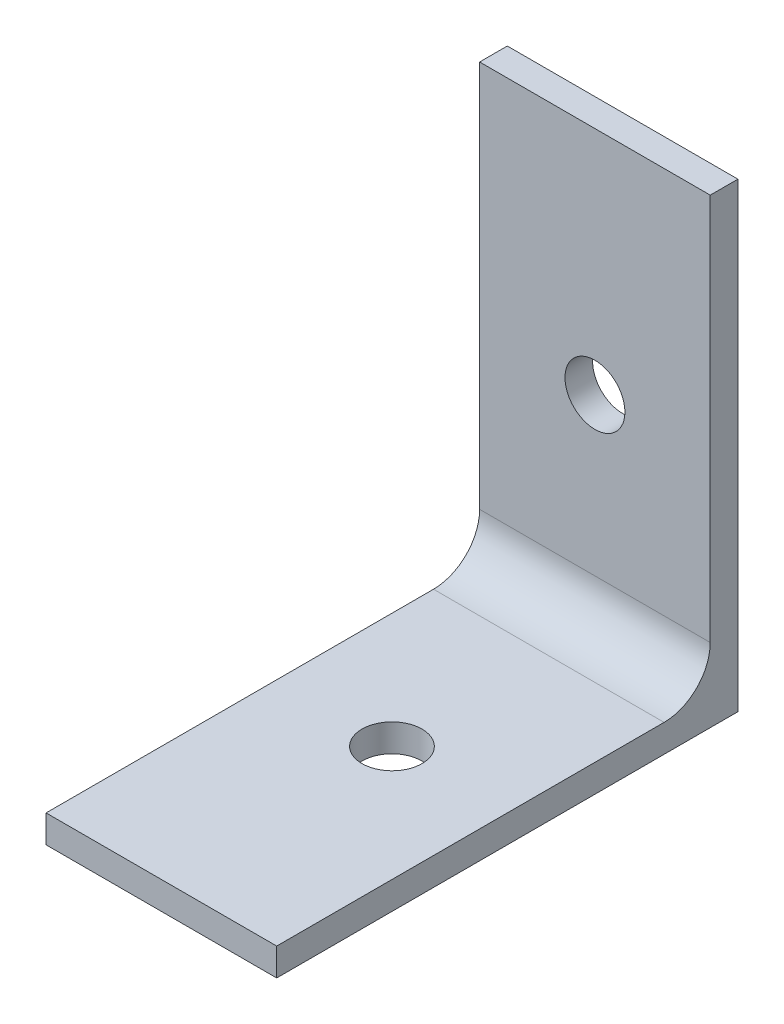
ISO-10303-21;
HEADER;
FILE_DESCRIPTION(('STEP AP214'),'2;1');
FILE_NAME('part.step','',(''),(''),'','','');
FILE_SCHEMA(('AUTOMOTIVE_DESIGN { 1 0 10303 214 1 1 1 1 }'));
ENDSEC;
DATA;
#1=APPLICATION_CONTEXT('core data for automotive mechanical design processes');
#2=APPLICATION_PROTOCOL_DEFINITION('international standard','automotive_design',2000,#1);
#3=PRODUCT_CONTEXT('',#1,'mechanical');
#4=PRODUCT('Part','Part','',(#3));
#5=PRODUCT_RELATED_PRODUCT_CATEGORY('part','',(#4));
#6=PRODUCT_DEFINITION_FORMATION('','',#4);
#7=PRODUCT_DEFINITION_CONTEXT('part definition',#1,'design');
#8=PRODUCT_DEFINITION('design','',#6,#7);
#9=PRODUCT_DEFINITION_SHAPE('','',#8);
#10=(LENGTH_UNIT() NAMED_UNIT(*) SI_UNIT(.MILLI.,.METRE.));
#11=(NAMED_UNIT(*) PLANE_ANGLE_UNIT() SI_UNIT($,.RADIAN.));
#12=(NAMED_UNIT(*) SI_UNIT($,.STERADIAN.) SOLID_ANGLE_UNIT());
#13=UNCERTAINTY_MEASURE_WITH_UNIT(LENGTH_MEASURE(1.E-05),#10,'distance_accuracy_value','');
#14=(GEOMETRIC_REPRESENTATION_CONTEXT(3) GLOBAL_UNCERTAINTY_ASSIGNED_CONTEXT((#13)) GLOBAL_UNIT_ASSIGNED_CONTEXT((#10,
#11,#12)) REPRESENTATION_CONTEXT('',''));
#15=CARTESIAN_POINT('',(0.,0.,0.));
#16=DIRECTION('',(0.,0.,1.));
#17=DIRECTION('',(1.,0.,0.));
#18=AXIS2_PLACEMENT_3D('',#15,#16,#17);
#19=CARTESIAN_POINT('',(-18.5339966832504,23.876,1.524));
#20=DIRECTION('',(1.,0.,0.));
#21=DIRECTION('',(0.,0.,-1.));
#22=AXIS2_PLACEMENT_3D('',#19,#20,#21);
#23=PLANE('',#22);
#24=DIRECTION('',(0.,-1.,0.));
#25=VECTOR('',#24,1.);
#26=CARTESIAN_POINT('',(-18.5339966832504,23.876,0.));
#27=LINE('',#26,#25);
#28=CARTESIAN_POINT('',(-18.5339966832504,23.876,0.));
#29=VERTEX_POINT('',#28);
#30=CARTESIAN_POINT('',(-18.5339966832504,-1.524,0.));
#31=VERTEX_POINT('',#30);
#32=EDGE_CURVE('E91',#29,#31,#27,.T.);
#33=ORIENTED_EDGE('',*,*,#32,.T.);
#34=DIRECTION('',(0.,0.,-1.));
#35=VECTOR('',#34,1.);
#36=CARTESIAN_POINT('',(-18.5339966832504,-1.524,0.));
#37=LINE('',#36,#35);
#38=CARTESIAN_POINT('',(-18.5339966832504,-1.524,25.4));
#39=VERTEX_POINT('',#38);
#40=EDGE_CURVE('E95',#39,#31,#37,.T.);
#41=ORIENTED_EDGE('',*,*,#40,.F.);
#42=DIRECTION('',(0.,1.,0.));
#43=VECTOR('',#42,1.);
#44=CARTESIAN_POINT('',(-18.5339966832504,-1.524,25.4));
#45=LINE('',#44,#43);
#46=CARTESIAN_POINT('',(-18.5339966832504,0.,25.4));
#47=VERTEX_POINT('',#46);
#48=EDGE_CURVE('E125',#39,#47,#45,.T.);
#49=ORIENTED_EDGE('',*,*,#48,.T.);
#50=DIRECTION('',(0.,0.,-1.));
#51=VECTOR('',#50,1.);
#52=CARTESIAN_POINT('',(-18.5339966832504,0.,0.));
#53=LINE('',#52,#51);
#54=CARTESIAN_POINT('',(-18.5339966832504,0.,4.064));
#55=VERTEX_POINT('',#54);
#56=EDGE_CURVE('E130',#47,#55,#53,.T.);
#57=ORIENTED_EDGE('',*,*,#56,.T.);
#58=CARTESIAN_POINT('',(-18.5339966832504,2.54,4.064));
#59=DIRECTION('',(1.,0.,0.));
#60=DIRECTION('',(0.,0.,-1.));
#61=AXIS2_PLACEMENT_3D('',#58,#59,#60);
#62=CIRCLE('',#61,2.54);
#63=CARTESIAN_POINT('',(-18.5339966832504,2.54,1.524));
#64=VERTEX_POINT('',#63);
#65=EDGE_CURVE('E11',#55,#64,#62,.T.);
#66=ORIENTED_EDGE('',*,*,#65,.T.);
#67=DIRECTION('',(0.,-1.,0.));
#68=VECTOR('',#67,1.);
#69=CARTESIAN_POINT('',(-18.5339966832504,23.876,1.524));
#70=LINE('',#69,#68);
#71=CARTESIAN_POINT('',(-18.5339966832504,23.876,1.524));
#72=VERTEX_POINT('',#71);
#73=EDGE_CURVE('E141',#72,#64,#70,.T.);
#74=ORIENTED_EDGE('',*,*,#73,.F.);
#75=DIRECTION('',(0.,0.,-1.));
#76=VECTOR('',#75,1.);
#77=CARTESIAN_POINT('',(-18.5339966832504,23.876,1.524));
#78=LINE('',#77,#76);
#79=EDGE_CURVE('E98',#72,#29,#78,.T.);
#80=ORIENTED_EDGE('',*,*,#79,.T.);
#81=EDGE_LOOP('',(#33,#41,#49,#57,#66,#74,#80));
#82=FACE_BOUND('',#81,.T.);
#83=ADVANCED_FACE('F32',(#82),#23,.F.);
#84=CARTESIAN_POINT('',(-5.83399668325041,23.876,1.524));
#85=DIRECTION('',(-1.,0.,0.));
#86=DIRECTION('',(0.,-1.,0.));
#87=AXIS2_PLACEMENT_3D('',#84,#85,#86);
#88=PLANE('',#87);
#89=DIRECTION('',(0.,1.,0.));
#90=VECTOR('',#89,1.);
#91=CARTESIAN_POINT('',(-5.83399668325041,23.876,0.));
#92=LINE('',#91,#90);
#93=CARTESIAN_POINT('',(-5.83399668325041,-1.524,0.));
#94=VERTEX_POINT('',#93);
#95=CARTESIAN_POINT('',(-5.83399668325041,23.876,0.));
#96=VERTEX_POINT('',#95);
#97=EDGE_CURVE('E101',#94,#96,#92,.T.);
#98=ORIENTED_EDGE('',*,*,#97,.T.);
#99=DIRECTION('',(0.,0.,-1.));
#100=VECTOR('',#99,1.);
#101=CARTESIAN_POINT('',(-5.83399668325041,23.876,1.524));
#102=LINE('',#101,#100);
#103=CARTESIAN_POINT('',(-5.83399668325041,23.876,1.524));
#104=VERTEX_POINT('',#103);
#105=EDGE_CURVE('E143',#104,#96,#102,.T.);
#106=ORIENTED_EDGE('',*,*,#105,.F.);
#107=DIRECTION('',(0.,1.,0.));
#108=VECTOR('',#107,1.);
#109=CARTESIAN_POINT('',(-5.83399668325041,23.876,1.524));
#110=LINE('',#109,#108);
#111=CARTESIAN_POINT('',(-5.83399668325041,2.54,1.524));
#112=VERTEX_POINT('',#111);
#113=EDGE_CURVE('E136',#112,#104,#110,.T.);
#114=ORIENTED_EDGE('',*,*,#113,.F.);
#115=CARTESIAN_POINT('',(-5.83399668325041,2.54,4.064));
#116=DIRECTION('',(-1.,0.,0.));
#117=DIRECTION('',(0.,-1.,0.));
#118=AXIS2_PLACEMENT_3D('',#115,#116,#117);
#119=CIRCLE('',#118,2.54);
#120=CARTESIAN_POINT('',(-5.83399668325041,0.,4.064));
#121=VERTEX_POINT('',#120);
#122=EDGE_CURVE('E40',#112,#121,#119,.T.);
#123=ORIENTED_EDGE('',*,*,#122,.T.);
#124=DIRECTION('',(0.,0.,1.));
#125=VECTOR('',#124,1.);
#126=CARTESIAN_POINT('',(-5.83399668325041,0.,0.));
#127=LINE('',#126,#125);
#128=CARTESIAN_POINT('',(-5.83399668325041,0.,25.4));
#129=VERTEX_POINT('',#128);
#130=EDGE_CURVE('E117',#121,#129,#127,.T.);
#131=ORIENTED_EDGE('',*,*,#130,.T.);
#132=DIRECTION('',(0.,1.,0.));
#133=VECTOR('',#132,1.);
#134=CARTESIAN_POINT('',(-5.83399668325041,-1.524,25.4));
#135=LINE('',#134,#133);
#136=CARTESIAN_POINT('',(-5.83399668325041,-1.524,25.4));
#137=VERTEX_POINT('',#136);
#138=EDGE_CURVE('E102',#137,#129,#135,.T.);
#139=ORIENTED_EDGE('',*,*,#138,.F.);
#140=DIRECTION('',(0.,0.,1.));
#141=VECTOR('',#140,1.);
#142=CARTESIAN_POINT('',(-5.83399668325041,-1.524,0.));
#143=LINE('',#142,#141);
#144=EDGE_CURVE('E109',#94,#137,#143,.T.);
#145=ORIENTED_EDGE('',*,*,#144,.F.);
#146=EDGE_LOOP('',(#98,#106,#114,#123,#131,#139,#145));
#147=FACE_BOUND('',#146,.T.);
#148=ADVANCED_FACE('F158',(#147),#88,.F.);
#149=CARTESIAN_POINT('',(-18.5339966832504,23.876,1.524));
#150=DIRECTION('',(0.,-1.,0.));
#151=DIRECTION('',(0.,0.,-1.));
#152=AXIS2_PLACEMENT_3D('',#149,#150,#151);
#153=PLANE('',#152);
#154=DIRECTION('',(-1.,0.,0.));
#155=VECTOR('',#154,1.);
#156=CARTESIAN_POINT('',(-18.5339966832504,23.876,0.));
#157=LINE('',#156,#155);
#158=EDGE_CURVE('E139',#96,#29,#157,.T.);
#159=ORIENTED_EDGE('',*,*,#158,.T.);
#160=ORIENTED_EDGE('',*,*,#79,.F.);
#161=DIRECTION('',(-1.,0.,0.));
#162=VECTOR('',#161,1.);
#163=CARTESIAN_POINT('',(-18.5339966832504,23.876,1.524));
#164=LINE('',#163,#162);
#165=EDGE_CURVE('E135',#104,#72,#164,.T.);
#166=ORIENTED_EDGE('',*,*,#165,.F.);
#167=ORIENTED_EDGE('',*,*,#105,.T.);
#168=EDGE_LOOP('',(#159,#160,#166,#167));
#169=FACE_BOUND('',#168,.T.);
#170=ADVANCED_FACE('F172',(#169),#153,.F.);
#171=CARTESIAN_POINT('',(0.,0.,1.524));
#172=DIRECTION('',(0.,0.,1.));
#173=DIRECTION('',(1.,0.,0.));
#174=AXIS2_PLACEMENT_3D('',#171,#172,#173);
#175=PLANE('',#174);
#176=CARTESIAN_POINT('',(-12.1839966832504,11.176,1.524));
#177=DIRECTION('',(0.,0.,1.));
#178=DIRECTION('',(1.,0.,0.));
#179=AXIS2_PLACEMENT_3D('',#176,#177,#178);
#180=CIRCLE('',#179,1.651);
#181=CARTESIAN_POINT('',(-10.5329966832504,11.176,1.524));
#182=VERTEX_POINT('',#181);
#183=EDGE_CURVE('E120',#182,#182,#180,.T.);
#184=ORIENTED_EDGE('',*,*,#183,.F.);
#185=EDGE_LOOP('',(#184));
#186=FACE_BOUND('',#185,.T.);
#187=ORIENTED_EDGE('',*,*,#73,.T.);
#188=DIRECTION('',(1.,0.,0.));
#189=VECTOR('',#188,1.);
#190=CARTESIAN_POINT('',(-5.83399668325041,2.54,1.524));
#191=LINE('',#190,#189);
#192=EDGE_CURVE('E146',#64,#112,#191,.T.);
#193=ORIENTED_EDGE('',*,*,#192,.T.);
#194=ORIENTED_EDGE('',*,*,#113,.T.);
#195=ORIENTED_EDGE('',*,*,#165,.T.);
#196=EDGE_LOOP('',(#187,#193,#194,#195));
#197=FACE_BOUND('',#196,.T.);
#198=ADVANCED_FACE('F168',(#186,#197),#175,.T.);
#199=CARTESIAN_POINT('',(0.,0.,0.));
#200=DIRECTION('',(0.,0.,1.));
#201=DIRECTION('',(1.,0.,0.));
#202=AXIS2_PLACEMENT_3D('',#199,#200,#201);
#203=PLANE('',#202);
#204=CARTESIAN_POINT('',(-12.1839966832504,11.176,0.));
#205=DIRECTION('',(0.,0.,1.));
#206=DIRECTION('',(1.,0.,0.));
#207=AXIS2_PLACEMENT_3D('',#204,#205,#206);
#208=CIRCLE('',#207,1.651);
#209=CARTESIAN_POINT('',(-10.5329966832504,11.176,0.));
#210=VERTEX_POINT('',#209);
#211=EDGE_CURVE('E133',#210,#210,#208,.T.);
#212=ORIENTED_EDGE('',*,*,#211,.T.);
#213=EDGE_LOOP('',(#212));
#214=FACE_BOUND('',#213,.T.);
#215=ORIENTED_EDGE('',*,*,#32,.F.);
#216=ORIENTED_EDGE('',*,*,#158,.F.);
#217=ORIENTED_EDGE('',*,*,#97,.F.);
#218=DIRECTION('',(1.,0.,0.));
#219=VECTOR('',#218,1.);
#220=CARTESIAN_POINT('',(-18.5339966832504,-1.524,0.));
#221=LINE('',#220,#219);
#222=EDGE_CURVE('E105',#31,#94,#221,.T.);
#223=ORIENTED_EDGE('',*,*,#222,.F.);
#224=EDGE_LOOP('',(#215,#216,#217,#223));
#225=FACE_BOUND('',#224,.T.);
#226=ADVANCED_FACE('F106',(#214,#225),#203,.F.);
#227=CARTESIAN_POINT('',(0.,0.,0.));
#228=DIRECTION('',(0.,1.,0.));
#229=DIRECTION('',(-1.,0.,0.));
#230=AXIS2_PLACEMENT_3D('',#227,#228,#229);
#231=PLANE('',#230);
#232=CARTESIAN_POINT('',(-12.1839966832504,0.,12.7));
#233=DIRECTION('',(0.,1.,0.));
#234=DIRECTION('',(-1.,0.,0.));
#235=AXIS2_PLACEMENT_3D('',#232,#233,#234);
#236=CIRCLE('',#235,1.651);
#237=CARTESIAN_POINT('',(-13.8349966832504,0.,12.7));
#238=VERTEX_POINT('',#237);
#239=EDGE_CURVE('E282',#238,#238,#236,.T.);
#240=ORIENTED_EDGE('',*,*,#239,.F.);
#241=EDGE_LOOP('',(#240));
#242=FACE_BOUND('',#241,.T.);
#243=ORIENTED_EDGE('',*,*,#130,.F.);
#244=DIRECTION('',(1.,0.,0.));
#245=VECTOR('',#244,1.);
#246=CARTESIAN_POINT('',(-18.5339966832504,0.,4.064));
#247=LINE('',#246,#245);
#248=EDGE_CURVE('E53',#121,#55,#247,.F.);
#249=ORIENTED_EDGE('',*,*,#248,.T.);
#250=ORIENTED_EDGE('',*,*,#56,.F.);
#251=DIRECTION('',(-1.,0.,0.));
#252=VECTOR('',#251,1.);
#253=CARTESIAN_POINT('',(-18.5339966832504,0.,25.4));
#254=LINE('',#253,#252);
#255=EDGE_CURVE('E115',#129,#47,#254,.T.);
#256=ORIENTED_EDGE('',*,*,#255,.F.);
#257=EDGE_LOOP('',(#243,#249,#250,#256));
#258=FACE_BOUND('',#257,.T.);
#259=ADVANCED_FACE('F162',(#242,#258),#231,.T.);
#260=CARTESIAN_POINT('',(-18.5339966832504,-1.524,25.4));
#261=DIRECTION('',(0.,0.,-1.));
#262=DIRECTION('',(-1.,0.,0.));
#263=AXIS2_PLACEMENT_3D('',#260,#261,#262);
#264=PLANE('',#263);
#265=ORIENTED_EDGE('',*,*,#255,.T.);
#266=ORIENTED_EDGE('',*,*,#48,.F.);
#267=DIRECTION('',(-1.,0.,0.));
#268=VECTOR('',#267,1.);
#269=CARTESIAN_POINT('',(-18.5339966832504,-1.524,25.4));
#270=LINE('',#269,#268);
#271=EDGE_CURVE('E113',#137,#39,#270,.T.);
#272=ORIENTED_EDGE('',*,*,#271,.F.);
#273=ORIENTED_EDGE('',*,*,#138,.T.);
#274=EDGE_LOOP('',(#265,#266,#272,#273));
#275=FACE_BOUND('',#274,.T.);
#276=ADVANCED_FACE('F161',(#275),#264,.F.);
#277=CARTESIAN_POINT('',(0.,-1.524,0.));
#278=DIRECTION('',(0.,1.,0.));
#279=DIRECTION('',(-1.,0.,0.));
#280=AXIS2_PLACEMENT_3D('',#277,#278,#279);
#281=PLANE('',#280);
#282=CARTESIAN_POINT('',(-12.1839966832504,-1.524,12.7));
#283=DIRECTION('',(0.,1.,0.));
#284=DIRECTION('',(-1.,0.,0.));
#285=AXIS2_PLACEMENT_3D('',#282,#283,#284);
#286=CIRCLE('',#285,1.651);
#287=CARTESIAN_POINT('',(-13.8349966832504,-1.524,12.7));
#288=VERTEX_POINT('',#287);
#289=EDGE_CURVE('E279',#288,#288,#286,.T.);
#290=ORIENTED_EDGE('',*,*,#289,.T.);
#291=EDGE_LOOP('',(#290));
#292=FACE_BOUND('',#291,.T.);
#293=ORIENTED_EDGE('',*,*,#40,.T.);
#294=ORIENTED_EDGE('',*,*,#222,.T.);
#295=ORIENTED_EDGE('',*,*,#144,.T.);
#296=ORIENTED_EDGE('',*,*,#271,.T.);
#297=EDGE_LOOP('',(#293,#294,#295,#296));
#298=FACE_BOUND('',#297,.T.);
#299=ADVANCED_FACE('F111',(#292,#298),#281,.F.);
#300=CARTESIAN_POINT('',(0.,2.54,4.064));
#301=DIRECTION('',(-1.,0.,0.));
#302=DIRECTION('',(0.,-1.,0.));
#303=AXIS2_PLACEMENT_3D('',#300,#301,#302);
#304=CYLINDRICAL_SURFACE('',#303,2.54);
#305=ORIENTED_EDGE('',*,*,#65,.F.);
#306=ORIENTED_EDGE('',*,*,#248,.F.);
#307=ORIENTED_EDGE('',*,*,#122,.F.);
#308=ORIENTED_EDGE('',*,*,#192,.F.);
#309=EDGE_LOOP('',(#305,#306,#307,#308));
#310=FACE_BOUND('',#309,.T.);
#311=ADVANCED_FACE('F34',(#310),#304,.F.);
#312=CARTESIAN_POINT('',(-12.1839966832504,11.176,0.));
#313=DIRECTION('',(0.,0.,1.));
#314=DIRECTION('',(1.,0.,0.));
#315=AXIS2_PLACEMENT_3D('',#312,#313,#314);
#316=CYLINDRICAL_SURFACE('',#315,1.651);
#317=CARTESIAN_POINT('',(-10.5329966832504,11.176,0.));
#318=CARTESIAN_POINT('',(-10.5329966832504,11.176,0.015875));
#319=CARTESIAN_POINT('',(-10.5329966832504,11.176,0.03175));
#320=CARTESIAN_POINT('',(-10.5329966832504,11.176,0.0635));
#321=CARTESIAN_POINT('',(-10.5329966832504,11.176,0.079375));
#322=CARTESIAN_POINT('',(-10.5329966832504,11.176,0.111125));
#323=CARTESIAN_POINT('',(-10.5329966832504,11.176,0.127));
#324=CARTESIAN_POINT('',(-10.5329966832504,11.176,0.15875));
#325=CARTESIAN_POINT('',(-10.5329966832504,11.176,0.174625));
#326=CARTESIAN_POINT('',(-10.5329966832504,11.176,0.206375));
#327=CARTESIAN_POINT('',(-10.5329966832504,11.176,0.22225));
#328=CARTESIAN_POINT('',(-10.5329966832504,11.176,0.254));
#329=CARTESIAN_POINT('',(-10.5329966832504,11.176,0.269875));
#330=CARTESIAN_POINT('',(-10.5329966832504,11.176,0.301625));
#331=CARTESIAN_POINT('',(-10.5329966832504,11.176,0.3175));
#332=CARTESIAN_POINT('',(-10.5329966832504,11.176,0.34925));
#333=CARTESIAN_POINT('',(-10.5329966832504,11.176,0.365125));
#334=CARTESIAN_POINT('',(-10.5329966832504,11.176,0.396875));
#335=CARTESIAN_POINT('',(-10.5329966832504,11.176,0.41275));
#336=CARTESIAN_POINT('',(-10.5329966832504,11.176,0.4445));
#337=CARTESIAN_POINT('',(-10.5329966832504,11.176,0.460375));
#338=CARTESIAN_POINT('',(-10.5329966832504,11.176,0.492125));
#339=CARTESIAN_POINT('',(-10.5329966832504,11.176,0.508));
#340=CARTESIAN_POINT('',(-10.5329966832504,11.176,0.53975));
#341=CARTESIAN_POINT('',(-10.5329966832504,11.176,0.555625));
#342=CARTESIAN_POINT('',(-10.5329966832504,11.176,0.587375));
#343=CARTESIAN_POINT('',(-10.5329966832504,11.176,0.60325));
#344=CARTESIAN_POINT('',(-10.5329966832504,11.176,0.635));
#345=CARTESIAN_POINT('',(-10.5329966832504,11.176,0.650875));
#346=CARTESIAN_POINT('',(-10.5329966832504,11.176,0.682625));
#347=CARTESIAN_POINT('',(-10.5329966832504,11.176,0.6985));
#348=CARTESIAN_POINT('',(-10.5329966832504,11.176,0.73025));
#349=CARTESIAN_POINT('',(-10.5329966832504,11.176,0.746125));
#350=CARTESIAN_POINT('',(-10.5329966832504,11.176,0.777875));
#351=CARTESIAN_POINT('',(-10.5329966832504,11.176,0.79375));
#352=CARTESIAN_POINT('',(-10.5329966832504,11.176,0.8255));
#353=CARTESIAN_POINT('',(-10.5329966832504,11.176,0.841375));
#354=CARTESIAN_POINT('',(-10.5329966832504,11.176,0.873125));
#355=CARTESIAN_POINT('',(-10.5329966832504,11.176,0.889));
#356=CARTESIAN_POINT('',(-10.5329966832504,11.176,0.92075));
#357=CARTESIAN_POINT('',(-10.5329966832504,11.176,0.936625));
#358=CARTESIAN_POINT('',(-10.5329966832504,11.176,0.968375));
#359=CARTESIAN_POINT('',(-10.5329966832504,11.176,0.98425));
#360=CARTESIAN_POINT('',(-10.5329966832504,11.176,1.016));
#361=CARTESIAN_POINT('',(-10.5329966832504,11.176,1.031875));
#362=CARTESIAN_POINT('',(-10.5329966832504,11.176,1.063625));
#363=CARTESIAN_POINT('',(-10.5329966832504,11.176,1.0795));
#364=CARTESIAN_POINT('',(-10.5329966832504,11.176,1.11125));
#365=CARTESIAN_POINT('',(-10.5329966832504,11.176,1.127125));
#366=CARTESIAN_POINT('',(-10.5329966832504,11.176,1.158875));
#367=CARTESIAN_POINT('',(-10.5329966832504,11.176,1.17475));
#368=CARTESIAN_POINT('',(-10.5329966832504,11.176,1.2065));
#369=CARTESIAN_POINT('',(-10.5329966832504,11.176,1.222375));
#370=CARTESIAN_POINT('',(-10.5329966832504,11.176,1.254125));
#371=CARTESIAN_POINT('',(-10.5329966832504,11.176,1.27));
#372=CARTESIAN_POINT('',(-10.5329966832504,11.176,1.30175));
#373=CARTESIAN_POINT('',(-10.5329966832504,11.176,1.317625));
#374=CARTESIAN_POINT('',(-10.5329966832504,11.176,1.349375));
#375=CARTESIAN_POINT('',(-10.5329966832504,11.176,1.36525));
#376=CARTESIAN_POINT('',(-10.5329966832504,11.176,1.397));
#377=CARTESIAN_POINT('',(-10.5329966832504,11.176,1.412875));
#378=CARTESIAN_POINT('',(-10.5329966832504,11.176,1.444625));
#379=CARTESIAN_POINT('',(-10.5329966832504,11.176,1.4605));
#380=CARTESIAN_POINT('',(-10.5329966832504,11.176,1.49225));
#381=CARTESIAN_POINT('',(-10.5329966832504,11.176,1.508125));
#382=CARTESIAN_POINT('',(-10.5329966832504,11.176,1.524));
#383=B_SPLINE_CURVE_WITH_KNOTS('',3,(#317,#318,#319,#320,#321,#322,#323,#324,#325,#326,#327,
#328,#329,#330,#331,#332,#333,#334,#335,#336,#337,#338,#339,#340,#341,#342,#343,#344,#345,#346,
#347,#348,#349,#350,#351,#352,#353,#354,#355,#356,#357,#358,#359,#360,#361,#362,#363,#364,#365,
#366,#367,#368,#369,#370,#371,#372,#373,#374,#375,#376,#377,#378,#379,#380,#381,#382),
.UNSPECIFIED.,.F.,.F.,(4,2,2,2,2,2,2,2,2,2,2,2,2,2,2,2,2,2,2,2,2,2,2,2,2,2,2,2,2,2,2,2,4),(0.,
0.047625,0.09525,0.142875,0.1905,0.238125,0.28575,0.333375,0.381,0.428625,0.47625,0.523875,
0.5715,0.619125,0.66675,0.714375,0.762,0.809625,0.85725,0.904875,0.9525,1.000125,1.04775,
1.095375,1.143,1.190625,1.23825,1.285875,1.3335,1.381125,1.42875,1.476375,1.524),.UNSPECIFIED.);
#384=EDGE_CURVE('BSEAM202',#210,#182,#383,.T.);
#385=ORIENTED_EDGE('',*,*,#211,.F.);
#386=ORIENTED_EDGE('',*,*,#183,.T.);
#387=ORIENTED_EDGE('',*,*,#384,.T.);
#388=ORIENTED_EDGE('',*,*,#384,.F.);
#389=EDGE_LOOP('',(#385,#387,#386,#388));
#390=FACE_BOUND('',#389,.T.);
#391=ADVANCED_FACE('F202',(#390),#316,.F.);
#392=CARTESIAN_POINT('',(-12.1839966832504,-1.524,12.7));
#393=DIRECTION('',(0.,1.,0.));
#394=DIRECTION('',(-1.,0.,0.));
#395=AXIS2_PLACEMENT_3D('',#392,#393,#394);
#396=CYLINDRICAL_SURFACE('',#395,1.651);
#397=CARTESIAN_POINT('',(-13.8349966832504,-1.524,12.7));
#398=CARTESIAN_POINT('',(-13.8349966832504,-1.508125,12.7));
#399=CARTESIAN_POINT('',(-13.8349966832504,-1.49225,12.7));
#400=CARTESIAN_POINT('',(-13.8349966832504,-1.4605,12.7));
#401=CARTESIAN_POINT('',(-13.8349966832504,-1.444625,12.7));
#402=CARTESIAN_POINT('',(-13.8349966832504,-1.412875,12.7));
#403=CARTESIAN_POINT('',(-13.8349966832504,-1.397,12.7));
#404=CARTESIAN_POINT('',(-13.8349966832504,-1.36525,12.7));
#405=CARTESIAN_POINT('',(-13.8349966832504,-1.349375,12.7));
#406=CARTESIAN_POINT('',(-13.8349966832504,-1.317625,12.7));
#407=CARTESIAN_POINT('',(-13.8349966832504,-1.30175,12.7));
#408=CARTESIAN_POINT('',(-13.8349966832504,-1.27,12.7));
#409=CARTESIAN_POINT('',(-13.8349966832504,-1.254125,12.7));
#410=CARTESIAN_POINT('',(-13.8349966832504,-1.222375,12.7));
#411=CARTESIAN_POINT('',(-13.8349966832504,-1.2065,12.7));
#412=CARTESIAN_POINT('',(-13.8349966832504,-1.17475,12.7));
#413=CARTESIAN_POINT('',(-13.8349966832504,-1.158875,12.7));
#414=CARTESIAN_POINT('',(-13.8349966832504,-1.127125,12.7));
#415=CARTESIAN_POINT('',(-13.8349966832504,-1.11125,12.7));
#416=CARTESIAN_POINT('',(-13.8349966832504,-1.0795,12.7));
#417=CARTESIAN_POINT('',(-13.8349966832504,-1.063625,12.7));
#418=CARTESIAN_POINT('',(-13.8349966832504,-1.031875,12.7));
#419=CARTESIAN_POINT('',(-13.8349966832504,-1.016,12.7));
#420=CARTESIAN_POINT('',(-13.8349966832504,-0.98425,12.7));
#421=CARTESIAN_POINT('',(-13.8349966832504,-0.968375,12.7));
#422=CARTESIAN_POINT('',(-13.8349966832504,-0.936625,12.7));
#423=CARTESIAN_POINT('',(-13.8349966832504,-0.92075,12.7));
#424=CARTESIAN_POINT('',(-13.8349966832504,-0.889,12.7));
#425=CARTESIAN_POINT('',(-13.8349966832504,-0.873125,12.7));
#426=CARTESIAN_POINT('',(-13.8349966832504,-0.841375,12.7));
#427=CARTESIAN_POINT('',(-13.8349966832504,-0.8255,12.7));
#428=CARTESIAN_POINT('',(-13.8349966832504,-0.79375,12.7));
#429=CARTESIAN_POINT('',(-13.8349966832504,-0.777875,12.7));
#430=CARTESIAN_POINT('',(-13.8349966832504,-0.746125,12.7));
#431=CARTESIAN_POINT('',(-13.8349966832504,-0.73025,12.7));
#432=CARTESIAN_POINT('',(-13.8349966832504,-0.6985,12.7));
#433=CARTESIAN_POINT('',(-13.8349966832504,-0.682625,12.7));
#434=CARTESIAN_POINT('',(-13.8349966832504,-0.650875,12.7));
#435=CARTESIAN_POINT('',(-13.8349966832504,-0.635,12.7));
#436=CARTESIAN_POINT('',(-13.8349966832504,-0.60325,12.7));
#437=CARTESIAN_POINT('',(-13.8349966832504,-0.587375,12.7));
#438=CARTESIAN_POINT('',(-13.8349966832504,-0.555625,12.7));
#439=CARTESIAN_POINT('',(-13.8349966832504,-0.53975,12.7));
#440=CARTESIAN_POINT('',(-13.8349966832504,-0.508,12.7));
#441=CARTESIAN_POINT('',(-13.8349966832504,-0.492125,12.7));
#442=CARTESIAN_POINT('',(-13.8349966832504,-0.460375,12.7));
#443=CARTESIAN_POINT('',(-13.8349966832504,-0.4445,12.7));
#444=CARTESIAN_POINT('',(-13.8349966832504,-0.41275,12.7));
#445=CARTESIAN_POINT('',(-13.8349966832504,-0.396875,12.7));
#446=CARTESIAN_POINT('',(-13.8349966832504,-0.365125,12.7));
#447=CARTESIAN_POINT('',(-13.8349966832504,-0.34925,12.7));
#448=CARTESIAN_POINT('',(-13.8349966832504,-0.3175,12.7));
#449=CARTESIAN_POINT('',(-13.8349966832504,-0.301625,12.7));
#450=CARTESIAN_POINT('',(-13.8349966832504,-0.269875,12.7));
#451=CARTESIAN_POINT('',(-13.8349966832504,-0.254,12.7));
#452=CARTESIAN_POINT('',(-13.8349966832504,-0.22225,12.7));
#453=CARTESIAN_POINT('',(-13.8349966832504,-0.206375,12.7));
#454=CARTESIAN_POINT('',(-13.8349966832504,-0.174625,12.7));
#455=CARTESIAN_POINT('',(-13.8349966832504,-0.15875,12.7));
#456=CARTESIAN_POINT('',(-13.8349966832504,-0.127,12.7));
#457=CARTESIAN_POINT('',(-13.8349966832504,-0.111125,12.7));
#458=CARTESIAN_POINT('',(-13.8349966832504,-0.079375,12.7));
#459=CARTESIAN_POINT('',(-13.8349966832504,-0.0635,12.7));
#460=CARTESIAN_POINT('',(-13.8349966832504,-0.0317499999999999,12.7));
#461=CARTESIAN_POINT('',(-13.8349966832504,-0.015875,12.7));
#462=CARTESIAN_POINT('',(-13.8349966832504,0.,12.7));
#463=B_SPLINE_CURVE_WITH_KNOTS('',3,(#397,#398,#399,#400,#401,#402,#403,#404,#405,#406,#407,
#408,#409,#410,#411,#412,#413,#414,#415,#416,#417,#418,#419,#420,#421,#422,#423,#424,#425,#426,
#427,#428,#429,#430,#431,#432,#433,#434,#435,#436,#437,#438,#439,#440,#441,#442,#443,#444,#445,
#446,#447,#448,#449,#450,#451,#452,#453,#454,#455,#456,#457,#458,#459,#460,#461,#462),
.UNSPECIFIED.,.F.,.F.,(4,2,2,2,2,2,2,2,2,2,2,2,2,2,2,2,2,2,2,2,2,2,2,2,2,2,2,2,2,2,2,2,4),(0.,
0.0476249999999999,0.0952499999999998,0.142875,0.1905,0.238125,0.28575,0.333375,0.381,0.428625,
0.47625,0.523875,0.5715,0.619125,0.66675,0.714375,0.762,0.809625,0.85725,0.904875,0.9525,
1.000125,1.04775,1.095375,1.143,1.190625,1.23825,1.285875,1.3335,1.381125,1.42875,1.476375,
1.524),.UNSPECIFIED.);
#464=EDGE_CURVE('BSEAM229',#288,#238,#463,.T.);
#465=ORIENTED_EDGE('',*,*,#289,.F.);
#466=ORIENTED_EDGE('',*,*,#239,.T.);
#467=ORIENTED_EDGE('',*,*,#464,.T.);
#468=ORIENTED_EDGE('',*,*,#464,.F.);
#469=EDGE_LOOP('',(#465,#467,#466,#468));
#470=FACE_BOUND('',#469,.T.);
#471=ADVANCED_FACE('F229',(#470),#396,.F.);
#472=CLOSED_SHELL('',(#83,#148,#170,#198,#226,#259,#276,#299,#311,#391,#471));
#473=MANIFOLD_SOLID_BREP('B2',#472);
#474=ADVANCED_BREP_SHAPE_REPRESENTATION('',(#18,#473),#14);
#475=SHAPE_DEFINITION_REPRESENTATION(#9,#474);
ENDSEC;
END-ISO-10303-21;
